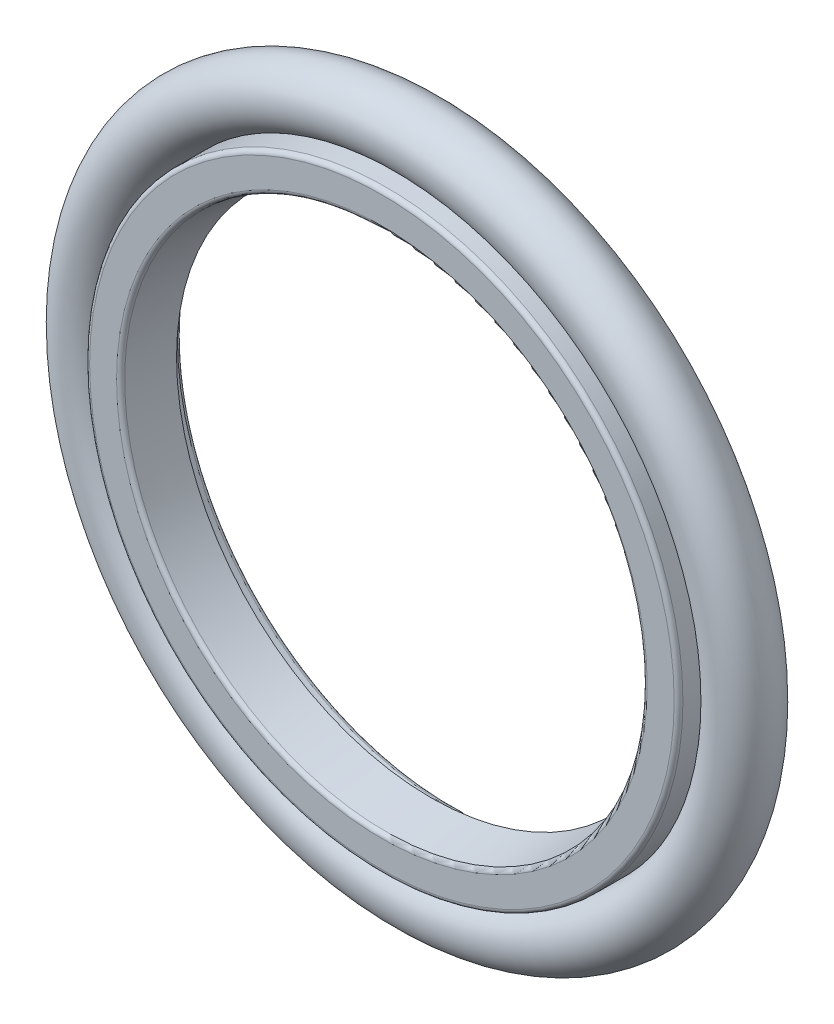
ISO-10303-21;
HEADER;
FILE_DESCRIPTION(('STEP AP214'),'2;1');
FILE_NAME('part.step','',(''),(''),'','','');
FILE_SCHEMA(('AUTOMOTIVE_DESIGN { 1 0 10303 214 1 1 1 1 }'));
ENDSEC;
DATA;
#1=APPLICATION_CONTEXT('core data for automotive mechanical design processes');
#2=APPLICATION_PROTOCOL_DEFINITION('international standard','automotive_design',2000,#1);
#3=PRODUCT_CONTEXT('',#1,'mechanical');
#4=PRODUCT('Part','Part','',(#3));
#5=PRODUCT_RELATED_PRODUCT_CATEGORY('part','',(#4));
#6=PRODUCT_DEFINITION_FORMATION('','',#4);
#7=PRODUCT_DEFINITION_CONTEXT('part definition',#1,'design');
#8=PRODUCT_DEFINITION('design','',#6,#7);
#9=PRODUCT_DEFINITION_SHAPE('','',#8);
#10=(LENGTH_UNIT() NAMED_UNIT(*) SI_UNIT(.MILLI.,.METRE.));
#11=(NAMED_UNIT(*) PLANE_ANGLE_UNIT() SI_UNIT($,.RADIAN.));
#12=(NAMED_UNIT(*) SI_UNIT($,.STERADIAN.) SOLID_ANGLE_UNIT());
#13=UNCERTAINTY_MEASURE_WITH_UNIT(LENGTH_MEASURE(1.E-05),#10,'distance_accuracy_value','');
#14=(GEOMETRIC_REPRESENTATION_CONTEXT(3) GLOBAL_UNCERTAINTY_ASSIGNED_CONTEXT((#13)) GLOBAL_UNIT_ASSIGNED_CONTEXT((#10,
#11,#12)) REPRESENTATION_CONTEXT('',''));
#15=CARTESIAN_POINT('',(0.,0.,0.));
#16=DIRECTION('',(0.,0.,1.));
#17=DIRECTION('',(1.,0.,0.));
#18=AXIS2_PLACEMENT_3D('',#15,#16,#17);
#19=CARTESIAN_POINT('',(0.,0.,-2.));
#20=DIRECTION('',(0.,0.,1.));
#21=DIRECTION('',(1.,0.,0.));
#22=AXIS2_PLACEMENT_3D('',#19,#20,#21);
#23=TOROIDAL_SURFACE('',#22,18.65,1.75);
#24=CARTESIAN_POINT('',(20.4,0.,-2.));
#25=VERTEX_POINT('',#24);
#26=VERTEX_LOOP('',#25);
#27=FACE_BOUND('',#26,.T.);
#28=ADVANCED_FACE('F49',(#27),#23,.T.);
#29=CLOSED_SHELL('',(#28));
#30=MANIFOLD_SOLID_BREP('B2',#29);
#31=CARTESIAN_POINT('',(0.,0.,-0.250000000000001));
#32=DIRECTION('',(0.,0.,1.));
#33=DIRECTION('',(1.,0.,0.));
#34=AXIS2_PLACEMENT_3D('',#31,#32,#33);
#35=TOROIDAL_SURFACE('',#34,15.1168238504238,0.250000000000001);
#36=CARTESIAN_POINT('',(0.,0.,-0.214644660940673));
#37=DIRECTION('',(0.,0.,1.));
#38=DIRECTION('',(1.,0.,0.));
#39=AXIS2_PLACEMENT_3D('',#36,#37,#38);
#40=CIRCLE('',#39,14.8693364770085);
#41=CARTESIAN_POINT('',(14.8693364770085,0.,-0.214644660940673));
#42=VERTEX_POINT('',#41);
#43=EDGE_CURVE('E48',#42,#42,#40,.T.);
#44=ORIENTED_EDGE('',*,*,#43,.F.);
#45=EDGE_LOOP('',(#44));
#46=FACE_BOUND('',#45,.T.);
#47=CARTESIAN_POINT('',(0.,0.,0.));
#48=DIRECTION('',(0.,0.,1.));
#49=DIRECTION('',(1.,0.,0.));
#50=AXIS2_PLACEMENT_3D('',#47,#48,#49);
#51=CIRCLE('',#50,15.1168238504238);
#52=CARTESIAN_POINT('',(15.1168238504238,0.,0.));
#53=VERTEX_POINT('',#52);
#54=EDGE_CURVE('E100',#53,#53,#51,.T.);
#55=ORIENTED_EDGE('',*,*,#54,.T.);
#56=EDGE_LOOP('',(#55));
#57=FACE_BOUND('',#56,.T.);
#58=ADVANCED_FACE('F66',(#46,#57),#35,.T.);
#59=CARTESIAN_POINT('',(0.,0.,-0.214644660940673));
#60=DIRECTION('',(0.,0.,1.));
#61=DIRECTION('',(1.,0.,0.));
#62=AXIS2_PLACEMENT_3D('',#59,#60,#61);
#63=CONICAL_SURFACE('',#62,14.8693364770085,0.141897054604163);
#64=CARTESIAN_POINT('',(0.,0.,-2.8));
#65=DIRECTION('',(0.,0.,1.));
#66=DIRECTION('',(1.,0.,0.));
#67=AXIS2_PLACEMENT_3D('',#64,#65,#66);
#68=CIRCLE('',#67,14.5);
#69=CARTESIAN_POINT('',(14.5,0.,-2.8));
#70=VERTEX_POINT('',#69);
#71=EDGE_CURVE('E72',#70,#70,#68,.T.);
#72=ORIENTED_EDGE('',*,*,#71,.F.);
#73=EDGE_LOOP('',(#72));
#74=FACE_BOUND('',#73,.T.);
#75=ORIENTED_EDGE('',*,*,#43,.T.);
#76=EDGE_LOOP('',(#75));
#77=FACE_BOUND('',#76,.T.);
#78=ADVANCED_FACE('F149',(#74,#77),#63,.F.);
#79=CARTESIAN_POINT('',(0.,0.,-2.8));
#80=DIRECTION('',(0.,0.,-1.));
#81=DIRECTION('',(-1.,0.,0.));
#82=AXIS2_PLACEMENT_3D('',#79,#80,#81);
#83=CONICAL_SURFACE('',#82,14.5,1.15257199721567);
#84=CARTESIAN_POINT('',(0.,0.,-3.2));
#85=DIRECTION('',(0.,0.,1.));
#86=DIRECTION('',(1.,0.,0.));
#87=AXIS2_PLACEMENT_3D('',#84,#85,#86);
#88=CIRCLE('',#87,15.4);
#89=CARTESIAN_POINT('',(15.4,0.,-3.2));
#90=VERTEX_POINT('',#89);
#91=EDGE_CURVE('E76',#90,#90,#88,.T.);
#92=ORIENTED_EDGE('',*,*,#91,.F.);
#93=EDGE_LOOP('',(#92));
#94=FACE_BOUND('',#93,.T.);
#95=ORIENTED_EDGE('',*,*,#71,.T.);
#96=EDGE_LOOP('',(#95));
#97=FACE_BOUND('',#96,.T.);
#98=ADVANCED_FACE('F144',(#94,#97),#83,.F.);
#99=CARTESIAN_POINT('',(0.,0.,0.));
#100=DIRECTION('',(0.,0.,1.));
#101=DIRECTION('',(1.,0.,0.));
#102=AXIS2_PLACEMENT_3D('',#99,#100,#101);
#103=CYLINDRICAL_SURFACE('',#102,15.4);
#104=CARTESIAN_POINT('',(0.,0.,-3.75));
#105=DIRECTION('',(0.,0.,1.));
#106=DIRECTION('',(1.,0.,0.));
#107=AXIS2_PLACEMENT_3D('',#104,#105,#106);
#108=CIRCLE('',#107,15.4);
#109=CARTESIAN_POINT('',(15.4,0.,-3.75));
#110=VERTEX_POINT('',#109);
#111=EDGE_CURVE('E80',#110,#110,#108,.T.);
#112=ORIENTED_EDGE('',*,*,#111,.F.);
#113=EDGE_LOOP('',(#112));
#114=FACE_BOUND('',#113,.T.);
#115=ORIENTED_EDGE('',*,*,#91,.T.);
#116=EDGE_LOOP('',(#115));
#117=FACE_BOUND('',#116,.T.);
#118=ADVANCED_FACE('F138',(#114,#117),#103,.F.);
#119=CARTESIAN_POINT('',(0.,0.,-3.75));
#120=DIRECTION('',(0.,0.,1.));
#121=DIRECTION('',(1.,0.,0.));
#122=AXIS2_PLACEMENT_3D('',#119,#120,#121);
#123=TOROIDAL_SURFACE('',#122,15.65,0.25);
#124=CARTESIAN_POINT('',(0.,0.,-4.));
#125=DIRECTION('',(0.,0.,1.));
#126=DIRECTION('',(1.,0.,0.));
#127=AXIS2_PLACEMENT_3D('',#124,#125,#126);
#128=CIRCLE('',#127,15.65);
#129=CARTESIAN_POINT('',(15.65,0.,-4.));
#130=VERTEX_POINT('',#129);
#131=EDGE_CURVE('E85',#130,#130,#128,.T.);
#132=ORIENTED_EDGE('',*,*,#131,.F.);
#133=EDGE_LOOP('',(#132));
#134=FACE_BOUND('',#133,.T.);
#135=ORIENTED_EDGE('',*,*,#111,.T.);
#136=EDGE_LOOP('',(#135));
#137=FACE_BOUND('',#136,.T.);
#138=ADVANCED_FACE('F132',(#134,#137),#123,.T.);
#139=CARTESIAN_POINT('',(0.,16.65,-4.));
#140=DIRECTION('',(0.,0.,1.));
#141=DIRECTION('',(1.,0.,0.));
#142=AXIS2_PLACEMENT_3D('',#139,#140,#141);
#143=PLANE('',#142);
#144=CARTESIAN_POINT('',(0.,0.,-4.));
#145=DIRECTION('',(0.,0.,1.));
#146=DIRECTION('',(1.,0.,0.));
#147=AXIS2_PLACEMENT_3D('',#144,#145,#146);
#148=CIRCLE('',#147,16.65);
#149=CARTESIAN_POINT('',(16.65,0.,-4.));
#150=VERTEX_POINT('',#149);
#151=EDGE_CURVE('E88',#150,#150,#148,.T.);
#152=ORIENTED_EDGE('',*,*,#151,.F.);
#153=EDGE_LOOP('',(#152));
#154=FACE_BOUND('',#153,.T.);
#155=ORIENTED_EDGE('',*,*,#131,.T.);
#156=EDGE_LOOP('',(#155));
#157=FACE_BOUND('',#156,.T.);
#158=ADVANCED_FACE('F126',(#154,#157),#143,.F.);
#159=CARTESIAN_POINT('',(0.,0.,-3.75));
#160=DIRECTION('',(0.,0.,1.));
#161=DIRECTION('',(1.,0.,0.));
#162=AXIS2_PLACEMENT_3D('',#159,#160,#161);
#163=TOROIDAL_SURFACE('',#162,16.65,0.25);
#164=CARTESIAN_POINT('',(0.,0.,-3.75));
#165=DIRECTION('',(0.,0.,1.));
#166=DIRECTION('',(1.,0.,0.));
#167=AXIS2_PLACEMENT_3D('',#164,#165,#166);
#168=CIRCLE('',#167,16.9);
#169=CARTESIAN_POINT('',(16.9,0.,-3.75));
#170=VERTEX_POINT('',#169);
#171=EDGE_CURVE('E91',#170,#170,#168,.T.);
#172=ORIENTED_EDGE('',*,*,#171,.F.);
#173=EDGE_LOOP('',(#172));
#174=FACE_BOUND('',#173,.T.);
#175=ORIENTED_EDGE('',*,*,#151,.T.);
#176=EDGE_LOOP('',(#175));
#177=FACE_BOUND('',#176,.T.);
#178=ADVANCED_FACE('F120',(#174,#177),#163,.T.);
#179=CARTESIAN_POINT('',(0.,0.,0.));
#180=DIRECTION('',(0.,0.,1.));
#181=DIRECTION('',(1.,0.,0.));
#182=AXIS2_PLACEMENT_3D('',#179,#180,#181);
#183=CYLINDRICAL_SURFACE('',#182,16.9);
#184=CARTESIAN_POINT('',(0.,0.,-0.25));
#185=DIRECTION('',(0.,0.,1.));
#186=DIRECTION('',(1.,0.,0.));
#187=AXIS2_PLACEMENT_3D('',#184,#185,#186);
#188=CIRCLE('',#187,16.9);
#189=CARTESIAN_POINT('',(16.9,0.,-0.25));
#190=VERTEX_POINT('',#189);
#191=EDGE_CURVE('E94',#190,#190,#188,.T.);
#192=ORIENTED_EDGE('',*,*,#191,.F.);
#193=EDGE_LOOP('',(#192));
#194=FACE_BOUND('',#193,.T.);
#195=ORIENTED_EDGE('',*,*,#171,.T.);
#196=EDGE_LOOP('',(#195));
#197=FACE_BOUND('',#196,.T.);
#198=ADVANCED_FACE('F114',(#194,#197),#183,.T.);
#199=CARTESIAN_POINT('',(0.,0.,-0.25));
#200=DIRECTION('',(0.,0.,1.));
#201=DIRECTION('',(1.,0.,0.));
#202=AXIS2_PLACEMENT_3D('',#199,#200,#201);
#203=TOROIDAL_SURFACE('',#202,16.65,0.25);
#204=CARTESIAN_POINT('',(0.,0.,0.));
#205=DIRECTION('',(0.,0.,1.));
#206=DIRECTION('',(1.,0.,0.));
#207=AXIS2_PLACEMENT_3D('',#204,#205,#206);
#208=CIRCLE('',#207,16.65);
#209=CARTESIAN_POINT('',(16.65,0.,0.));
#210=VERTEX_POINT('',#209);
#211=EDGE_CURVE('E97',#210,#210,#208,.T.);
#212=ORIENTED_EDGE('',*,*,#211,.F.);
#213=EDGE_LOOP('',(#212));
#214=FACE_BOUND('',#213,.T.);
#215=ORIENTED_EDGE('',*,*,#191,.T.);
#216=EDGE_LOOP('',(#215));
#217=FACE_BOUND('',#216,.T.);
#218=ADVANCED_FACE('F108',(#214,#217),#203,.T.);
#219=CARTESIAN_POINT('',(0.,16.65,0.));
#220=DIRECTION('',(0.,0.,-1.));
#221=DIRECTION('',(-1.,0.,0.));
#222=AXIS2_PLACEMENT_3D('',#219,#220,#221);
#223=PLANE('',#222);
#224=ORIENTED_EDGE('',*,*,#54,.F.);
#225=EDGE_LOOP('',(#224));
#226=FACE_BOUND('',#225,.T.);
#227=ORIENTED_EDGE('',*,*,#211,.T.);
#228=EDGE_LOOP('',(#227));
#229=FACE_BOUND('',#228,.T.);
#230=ADVANCED_FACE('F105',(#226,#229),#223,.F.);
#231=CLOSED_SHELL('',(#58,#78,#98,#118,#138,#158,#178,#198,#218,#230));
#232=MANIFOLD_SOLID_BREP('B6',#231);
#233=ADVANCED_BREP_SHAPE_REPRESENTATION('',(#18,#30,#232),#14);
#234=SHAPE_DEFINITION_REPRESENTATION(#9,#233);
ENDSEC;
END-ISO-10303-21;
